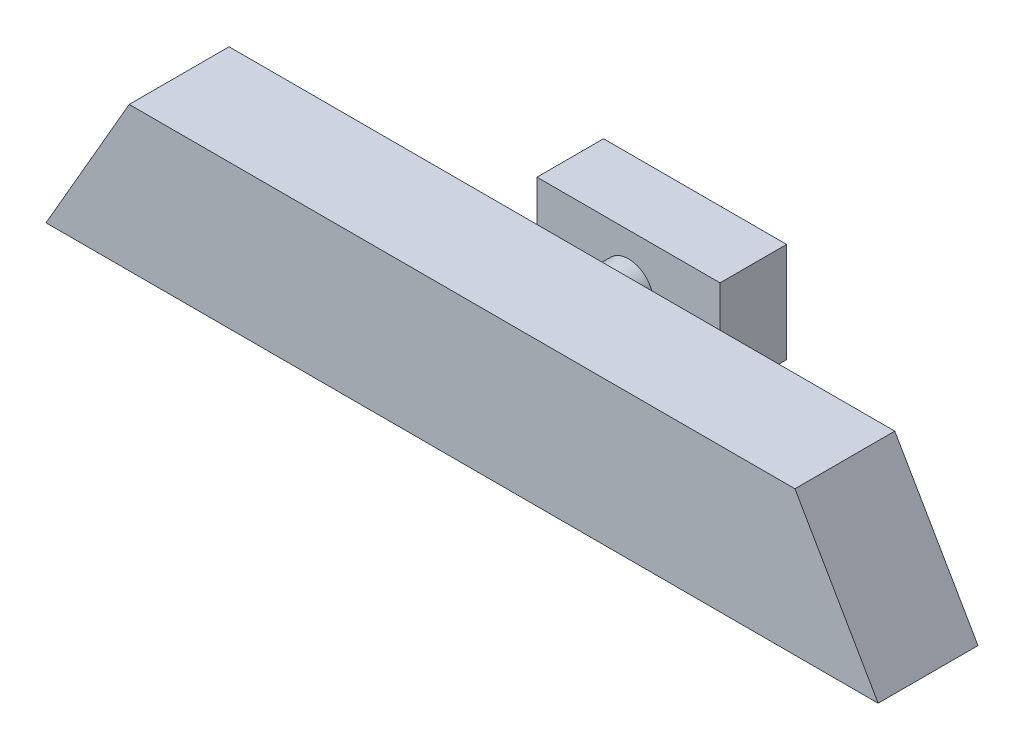
ISO-10303-21;
HEADER;
FILE_DESCRIPTION(('STEP AP214'),'2;1');
FILE_NAME('part.step','',(''),(''),'','','');
FILE_SCHEMA(('AUTOMOTIVE_DESIGN { 1 0 10303 214 1 1 1 1 }'));
ENDSEC;
DATA;
#1=APPLICATION_CONTEXT('core data for automotive mechanical design processes');
#2=APPLICATION_PROTOCOL_DEFINITION('international standard','automotive_design',2000,#1);
#3=PRODUCT_CONTEXT('',#1,'mechanical');
#4=PRODUCT('Part','Part','',(#3));
#5=PRODUCT_RELATED_PRODUCT_CATEGORY('part','',(#4));
#6=PRODUCT_DEFINITION_FORMATION('','',#4);
#7=PRODUCT_DEFINITION_CONTEXT('part definition',#1,'design');
#8=PRODUCT_DEFINITION('design','',#6,#7);
#9=PRODUCT_DEFINITION_SHAPE('','',#8);
#10=(LENGTH_UNIT() NAMED_UNIT(*) SI_UNIT(.MILLI.,.METRE.));
#11=(NAMED_UNIT(*) PLANE_ANGLE_UNIT() SI_UNIT($,.RADIAN.));
#12=(NAMED_UNIT(*) SI_UNIT($,.STERADIAN.) SOLID_ANGLE_UNIT());
#13=UNCERTAINTY_MEASURE_WITH_UNIT(LENGTH_MEASURE(1.E-05),#10,'distance_accuracy_value','');
#14=(GEOMETRIC_REPRESENTATION_CONTEXT(3) GLOBAL_UNCERTAINTY_ASSIGNED_CONTEXT((#13)) GLOBAL_UNIT_ASSIGNED_CONTEXT((#10,
#11,#12)) REPRESENTATION_CONTEXT('',''));
#15=CARTESIAN_POINT('',(0.,0.,0.));
#16=DIRECTION('',(0.,0.,1.));
#17=DIRECTION('',(1.,0.,0.));
#18=AXIS2_PLACEMENT_3D('',#15,#16,#17);
#19=CARTESIAN_POINT('',(-52.4607774957699,0.,0.));
#20=DIRECTION('',(0.,0.,1.));
#21=DIRECTION('',(1.,0.,0.));
#22=AXIS2_PLACEMENT_3D('',#19,#20,#21);
#23=PLANE('',#22);
#24=DIRECTION('',(-0.499999999999999,-0.866025403784439,0.));
#25=VECTOR('',#24,1.);
#26=CARTESIAN_POINT('',(-27.4607774957699,43.301270189222,0.));
#27=LINE('',#26,#25);
#28=CARTESIAN_POINT('',(-27.4607774957699,43.301270189222,0.));
#29=VERTEX_POINT('',#28);
#30=CARTESIAN_POINT('',(-52.4607774957699,0.,0.));
#31=VERTEX_POINT('',#30);
#32=EDGE_CURVE('E136',#29,#31,#27,.T.);
#33=ORIENTED_EDGE('',*,*,#32,.F.);
#34=DIRECTION('',(-1.,0.,0.));
#35=VECTOR('',#34,1.);
#36=CARTESIAN_POINT('',(172.53922250423,43.301270189222,0.));
#37=LINE('',#36,#35);
#38=CARTESIAN_POINT('',(172.53922250423,43.301270189222,0.));
#39=VERTEX_POINT('',#38);
#40=EDGE_CURVE('E73',#39,#29,#37,.T.);
#41=ORIENTED_EDGE('',*,*,#40,.F.);
#42=DIRECTION('',(-0.5,0.866025403784439,0.));
#43=VECTOR('',#42,1.);
#44=CARTESIAN_POINT('',(197.53922250423,0.,0.));
#45=LINE('',#44,#43);
#46=CARTESIAN_POINT('',(197.53922250423,0.,0.));
#47=VERTEX_POINT('',#46);
#48=EDGE_CURVE('E67',#47,#39,#45,.T.);
#49=ORIENTED_EDGE('',*,*,#48,.F.);
#50=DIRECTION('',(1.,0.,0.));
#51=VECTOR('',#50,1.);
#52=CARTESIAN_POINT('',(-52.4607774957699,0.,0.));
#53=LINE('',#52,#51);
#54=EDGE_CURVE('E151',#31,#47,#53,.T.);
#55=ORIENTED_EDGE('',*,*,#54,.F.);
#56=EDGE_LOOP('',(#33,#41,#49,#55));
#57=FACE_BOUND('',#56,.T.);
#58=CARTESIAN_POINT('',(72.5392225042301,20.6266821394395,0.));
#59=DIRECTION('',(0.,0.,1.));
#60=DIRECTION('',(1.,0.,0.));
#61=AXIS2_PLACEMENT_3D('',#58,#59,#60);
#62=CIRCLE('',#61,7.50000000000001);
#63=CARTESIAN_POINT('',(80.0392225042301,20.6266821394395,0.));
#64=VERTEX_POINT('',#63);
#65=EDGE_CURVE('E11',#64,#64,#62,.F.);
#66=ORIENTED_EDGE('',*,*,#65,.F.);
#67=EDGE_LOOP('',(#66));
#68=FACE_BOUND('',#67,.T.);
#69=ADVANCED_FACE('F32',(#57,#68),#23,.F.);
#70=CARTESIAN_POINT('',(-27.4607774957699,43.301270189222,30.));
#71=DIRECTION('',(0.866025403784439,-0.499999999999999,0.));
#72=DIRECTION('',(0.499999999999999,0.866025403784439,0.));
#73=AXIS2_PLACEMENT_3D('',#70,#71,#72);
#74=PLANE('',#73);
#75=ORIENTED_EDGE('',*,*,#32,.T.);
#76=DIRECTION('',(0.,0.,-1.));
#77=VECTOR('',#76,1.);
#78=CARTESIAN_POINT('',(-52.4607774957699,0.,30.));
#79=LINE('',#78,#77);
#80=CARTESIAN_POINT('',(-52.4607774957699,0.,30.));
#81=VERTEX_POINT('',#80);
#82=EDGE_CURVE('E41',#81,#31,#79,.T.);
#83=ORIENTED_EDGE('',*,*,#82,.F.);
#84=DIRECTION('',(-0.499999999999999,-0.866025403784439,0.));
#85=VECTOR('',#84,1.);
#86=CARTESIAN_POINT('',(-27.4607774957699,43.301270189222,30.));
#87=LINE('',#86,#85);
#88=CARTESIAN_POINT('',(-27.4607774957699,43.301270189222,30.));
#89=VERTEX_POINT('',#88);
#90=EDGE_CURVE('E142',#89,#81,#87,.T.);
#91=ORIENTED_EDGE('',*,*,#90,.F.);
#92=DIRECTION('',(0.,0.,-1.));
#93=VECTOR('',#92,1.);
#94=CARTESIAN_POINT('',(-27.4607774957699,43.301270189222,30.));
#95=LINE('',#94,#93);
#96=EDGE_CURVE('E148',#89,#29,#95,.T.);
#97=ORIENTED_EDGE('',*,*,#96,.T.);
#98=EDGE_LOOP('',(#75,#83,#91,#97));
#99=FACE_BOUND('',#98,.T.);
#100=ADVANCED_FACE('F34',(#99),#74,.F.);
#101=CARTESIAN_POINT('',(-52.4607774957699,0.,30.));
#102=DIRECTION('',(0.,1.,0.));
#103=DIRECTION('',(0.,0.,1.));
#104=AXIS2_PLACEMENT_3D('',#101,#102,#103);
#105=PLANE('',#104);
#106=ORIENTED_EDGE('',*,*,#54,.T.);
#107=DIRECTION('',(0.,0.,-1.));
#108=VECTOR('',#107,1.);
#109=CARTESIAN_POINT('',(197.53922250423,0.,30.));
#110=LINE('',#109,#108);
#111=CARTESIAN_POINT('',(197.53922250423,0.,30.));
#112=VERTEX_POINT('',#111);
#113=EDGE_CURVE('E158',#112,#47,#110,.T.);
#114=ORIENTED_EDGE('',*,*,#113,.F.);
#115=DIRECTION('',(1.,0.,0.));
#116=VECTOR('',#115,1.);
#117=CARTESIAN_POINT('',(-52.4607774957699,0.,30.));
#118=LINE('',#117,#116);
#119=EDGE_CURVE('E81',#81,#112,#118,.T.);
#120=ORIENTED_EDGE('',*,*,#119,.F.);
#121=ORIENTED_EDGE('',*,*,#82,.T.);
#122=EDGE_LOOP('',(#106,#114,#120,#121));
#123=FACE_BOUND('',#122,.T.);
#124=ADVANCED_FACE('F160',(#123),#105,.F.);
#125=CARTESIAN_POINT('',(197.53922250423,0.,30.));
#126=DIRECTION('',(-0.866025403784439,-0.5,0.));
#127=DIRECTION('',(0.5,-0.866025403784439,0.));
#128=AXIS2_PLACEMENT_3D('',#125,#126,#127);
#129=PLANE('',#128);
#130=ORIENTED_EDGE('',*,*,#48,.T.);
#131=DIRECTION('',(0.,0.,-1.));
#132=VECTOR('',#131,1.);
#133=CARTESIAN_POINT('',(172.53922250423,43.301270189222,30.));
#134=LINE('',#133,#132);
#135=CARTESIAN_POINT('',(172.53922250423,43.301270189222,30.));
#136=VERTEX_POINT('',#135);
#137=EDGE_CURVE('E156',#136,#39,#134,.T.);
#138=ORIENTED_EDGE('',*,*,#137,.F.);
#139=DIRECTION('',(-0.5,0.866025403784439,0.));
#140=VECTOR('',#139,1.);
#141=CARTESIAN_POINT('',(197.53922250423,0.,30.));
#142=LINE('',#141,#140);
#143=EDGE_CURVE('E145',#112,#136,#142,.T.);
#144=ORIENTED_EDGE('',*,*,#143,.F.);
#145=ORIENTED_EDGE('',*,*,#113,.T.);
#146=EDGE_LOOP('',(#130,#138,#144,#145));
#147=FACE_BOUND('',#146,.T.);
#148=ADVANCED_FACE('F190',(#147),#129,.F.);
#149=CARTESIAN_POINT('',(172.53922250423,43.301270189222,30.));
#150=DIRECTION('',(0.,-1.,0.));
#151=DIRECTION('',(0.,0.,-1.));
#152=AXIS2_PLACEMENT_3D('',#149,#150,#151);
#153=PLANE('',#152);
#154=ORIENTED_EDGE('',*,*,#40,.T.);
#155=ORIENTED_EDGE('',*,*,#96,.F.);
#156=DIRECTION('',(-1.,0.,0.));
#157=VECTOR('',#156,1.);
#158=CARTESIAN_POINT('',(172.53922250423,43.301270189222,30.));
#159=LINE('',#158,#157);
#160=EDGE_CURVE('E49',#136,#89,#159,.T.);
#161=ORIENTED_EDGE('',*,*,#160,.F.);
#162=ORIENTED_EDGE('',*,*,#137,.T.);
#163=EDGE_LOOP('',(#154,#155,#161,#162));
#164=FACE_BOUND('',#163,.T.);
#165=ADVANCED_FACE('F182',(#164),#153,.F.);
#166=CARTESIAN_POINT('',(-52.4607774957699,0.,30.));
#167=DIRECTION('',(0.,0.,1.));
#168=DIRECTION('',(1.,0.,0.));
#169=AXIS2_PLACEMENT_3D('',#166,#167,#168);
#170=PLANE('',#169);
#171=ORIENTED_EDGE('',*,*,#90,.T.);
#172=ORIENTED_EDGE('',*,*,#119,.T.);
#173=ORIENTED_EDGE('',*,*,#143,.T.);
#174=ORIENTED_EDGE('',*,*,#160,.T.);
#175=EDGE_LOOP('',(#171,#172,#173,#174));
#176=FACE_BOUND('',#175,.T.);
#177=ADVANCED_FACE('F173',(#176),#170,.T.);
#178=CARTESIAN_POINT('',(72.5392225042301,20.6266821394395,-20.));
#179=DIRECTION('',(0.,0.,1.));
#180=DIRECTION('',(1.,0.,0.));
#181=AXIS2_PLACEMENT_3D('',#178,#179,#180);
#182=CYLINDRICAL_SURFACE('',#181,7.50000000000001);
#183=CARTESIAN_POINT('',(72.5392225042301,20.6266821394395,-20.));
#184=DIRECTION('',(0.,0.,-1.));
#185=DIRECTION('',(-1.,0.,0.));
#186=AXIS2_PLACEMENT_3D('',#183,#184,#185);
#187=CIRCLE('',#186,7.50000000000001);
#188=CARTESIAN_POINT('',(65.0392225042301,20.6266821394395,-20.));
#189=VERTEX_POINT('',#188);
#190=EDGE_CURVE('E133',#189,#189,#187,.T.);
#191=ORIENTED_EDGE('',*,*,#190,.F.);
#192=EDGE_LOOP('',(#191));
#193=FACE_BOUND('',#192,.T.);
#194=ORIENTED_EDGE('',*,*,#65,.T.);
#195=EDGE_LOOP('',(#194));
#196=FACE_BOUND('',#195,.T.);
#197=ADVANCED_FACE('F170',(#193,#196),#182,.T.);
#198=CARTESIAN_POINT('',(100.03922250423,35.6266821394394,-20.));
#199=DIRECTION('',(0.,0.,-1.));
#200=DIRECTION('',(-1.,0.,0.));
#201=AXIS2_PLACEMENT_3D('',#198,#199,#200);
#202=PLANE('',#201);
#203=DIRECTION('',(0.,-1.,0.));
#204=VECTOR('',#203,1.);
#205=CARTESIAN_POINT('',(100.03922250423,5.62668213943945,-20.));
#206=LINE('',#205,#204);
#207=CARTESIAN_POINT('',(100.03922250423,35.6266821394394,-20.));
#208=VERTEX_POINT('',#207);
#209=CARTESIAN_POINT('',(100.03922250423,5.62668213943945,-20.));
#210=VERTEX_POINT('',#209);
#211=EDGE_CURVE('E132',#208,#210,#206,.T.);
#212=ORIENTED_EDGE('',*,*,#211,.F.);
#213=DIRECTION('',(1.,0.,0.));
#214=VECTOR('',#213,1.);
#215=CARTESIAN_POINT('',(45.0392225042301,35.6266821394395,-20.));
#216=LINE('',#215,#214);
#217=CARTESIAN_POINT('',(45.0392225042301,35.6266821394395,-20.));
#218=VERTEX_POINT('',#217);
#219=EDGE_CURVE('E128',#218,#208,#216,.T.);
#220=ORIENTED_EDGE('',*,*,#219,.F.);
#221=DIRECTION('',(0.,1.,0.));
#222=VECTOR('',#221,1.);
#223=CARTESIAN_POINT('',(45.0392225042301,5.62668213943946,-20.));
#224=LINE('',#223,#222);
#225=CARTESIAN_POINT('',(45.0392225042301,5.62668213943946,-20.));
#226=VERTEX_POINT('',#225);
#227=EDGE_CURVE('E297',#226,#218,#224,.T.);
#228=ORIENTED_EDGE('',*,*,#227,.F.);
#229=DIRECTION('',(-1.,0.,0.));
#230=VECTOR('',#229,1.);
#231=CARTESIAN_POINT('',(45.0392225042301,5.62668213943946,-20.));
#232=LINE('',#231,#230);
#233=EDGE_CURVE('E288',#210,#226,#232,.T.);
#234=ORIENTED_EDGE('',*,*,#233,.F.);
#235=EDGE_LOOP('',(#212,#220,#228,#234));
#236=FACE_BOUND('',#235,.T.);
#237=ORIENTED_EDGE('',*,*,#190,.T.);
#238=EDGE_LOOP('',(#237));
#239=FACE_BOUND('',#238,.T.);
#240=ADVANCED_FACE('F172',(#236,#239),#202,.F.);
#241=CARTESIAN_POINT('',(100.03922250423,5.62668213943945,-40.));
#242=DIRECTION('',(-1.,0.,0.));
#243=DIRECTION('',(0.,0.,1.));
#244=AXIS2_PLACEMENT_3D('',#241,#242,#243);
#245=PLANE('',#244);
#246=ORIENTED_EDGE('',*,*,#211,.T.);
#247=DIRECTION('',(0.,0.,1.));
#248=VECTOR('',#247,1.);
#249=CARTESIAN_POINT('',(100.03922250423,5.62668213943945,-40.));
#250=LINE('',#249,#248);
#251=CARTESIAN_POINT('',(100.03922250423,5.62668213943945,-40.));
#252=VERTEX_POINT('',#251);
#253=EDGE_CURVE('E112',#252,#210,#250,.T.);
#254=ORIENTED_EDGE('',*,*,#253,.F.);
#255=DIRECTION('',(0.,-1.,0.));
#256=VECTOR('',#255,1.);
#257=CARTESIAN_POINT('',(100.03922250423,5.62668213943945,-40.));
#258=LINE('',#257,#256);
#259=CARTESIAN_POINT('',(100.03922250423,35.6266821394394,-40.));
#260=VERTEX_POINT('',#259);
#261=EDGE_CURVE('E119',#260,#252,#258,.T.);
#262=ORIENTED_EDGE('',*,*,#261,.F.);
#263=DIRECTION('',(0.,0.,1.));
#264=VECTOR('',#263,1.);
#265=CARTESIAN_POINT('',(100.03922250423,35.6266821394394,-40.));
#266=LINE('',#265,#264);
#267=EDGE_CURVE('E294',#260,#208,#266,.T.);
#268=ORIENTED_EDGE('',*,*,#267,.T.);
#269=EDGE_LOOP('',(#246,#254,#262,#268));
#270=FACE_BOUND('',#269,.T.);
#271=ADVANCED_FACE('F130',(#270),#245,.F.);
#272=CARTESIAN_POINT('',(45.0392225042301,5.62668213943946,-40.));
#273=DIRECTION('',(0.,1.,0.));
#274=DIRECTION('',(-1.,0.,0.));
#275=AXIS2_PLACEMENT_3D('',#272,#273,#274);
#276=PLANE('',#275);
#277=ORIENTED_EDGE('',*,*,#233,.T.);
#278=DIRECTION('',(0.,0.,1.));
#279=VECTOR('',#278,1.);
#280=CARTESIAN_POINT('',(45.0392225042301,5.62668213943946,-40.));
#281=LINE('',#280,#279);
#282=CARTESIAN_POINT('',(45.0392225042301,5.62668213943946,-40.));
#283=VERTEX_POINT('',#282);
#284=EDGE_CURVE('E115',#283,#226,#281,.T.);
#285=ORIENTED_EDGE('',*,*,#284,.F.);
#286=DIRECTION('',(-1.,0.,0.));
#287=VECTOR('',#286,1.);
#288=CARTESIAN_POINT('',(45.0392225042301,5.62668213943946,-40.));
#289=LINE('',#288,#287);
#290=EDGE_CURVE('E108',#252,#283,#289,.T.);
#291=ORIENTED_EDGE('',*,*,#290,.F.);
#292=ORIENTED_EDGE('',*,*,#253,.T.);
#293=EDGE_LOOP('',(#277,#285,#291,#292));
#294=FACE_BOUND('',#293,.T.);
#295=ADVANCED_FACE('F110',(#294),#276,.F.);
#296=CARTESIAN_POINT('',(45.0392225042301,5.62668213943946,-40.));
#297=DIRECTION('',(1.,0.,0.));
#298=DIRECTION('',(0.,0.,-1.));
#299=AXIS2_PLACEMENT_3D('',#296,#297,#298);
#300=PLANE('',#299);
#301=ORIENTED_EDGE('',*,*,#227,.T.);
#302=DIRECTION('',(0.,0.,1.));
#303=VECTOR('',#302,1.);
#304=CARTESIAN_POINT('',(45.0392225042301,35.6266821394395,-40.));
#305=LINE('',#304,#303);
#306=CARTESIAN_POINT('',(45.0392225042301,35.6266821394395,-40.));
#307=VERTEX_POINT('',#306);
#308=EDGE_CURVE('E138',#307,#218,#305,.T.);
#309=ORIENTED_EDGE('',*,*,#308,.F.);
#310=DIRECTION('',(0.,1.,0.));
#311=VECTOR('',#310,1.);
#312=CARTESIAN_POINT('',(45.0392225042301,5.62668213943946,-40.));
#313=LINE('',#312,#311);
#314=EDGE_CURVE('E118',#283,#307,#313,.T.);
#315=ORIENTED_EDGE('',*,*,#314,.F.);
#316=ORIENTED_EDGE('',*,*,#284,.T.);
#317=EDGE_LOOP('',(#301,#309,#315,#316));
#318=FACE_BOUND('',#317,.T.);
#319=ADVANCED_FACE('F232',(#318),#300,.F.);
#320=CARTESIAN_POINT('',(45.0392225042301,35.6266821394395,-40.));
#321=DIRECTION('',(0.,-1.,0.));
#322=DIRECTION('',(1.,0.,0.));
#323=AXIS2_PLACEMENT_3D('',#320,#321,#322);
#324=PLANE('',#323);
#325=ORIENTED_EDGE('',*,*,#219,.T.);
#326=ORIENTED_EDGE('',*,*,#267,.F.);
#327=DIRECTION('',(1.,0.,0.));
#328=VECTOR('',#327,1.);
#329=CARTESIAN_POINT('',(45.0392225042301,35.6266821394395,-40.));
#330=LINE('',#329,#328);
#331=EDGE_CURVE('E124',#307,#260,#330,.T.);
#332=ORIENTED_EDGE('',*,*,#331,.F.);
#333=ORIENTED_EDGE('',*,*,#308,.T.);
#334=EDGE_LOOP('',(#325,#326,#332,#333));
#335=FACE_BOUND('',#334,.T.);
#336=ADVANCED_FACE('F240',(#335),#324,.F.);
#337=CARTESIAN_POINT('',(100.03922250423,35.6266821394394,-40.));
#338=DIRECTION('',(0.,0.,-1.));
#339=DIRECTION('',(-1.,0.,0.));
#340=AXIS2_PLACEMENT_3D('',#337,#338,#339);
#341=PLANE('',#340);
#342=CARTESIAN_POINT('',(72.5392225042301,20.6266821394395,-40.));
#343=DIRECTION('',(0.,0.,-1.));
#344=DIRECTION('',(-1.,0.,0.));
#345=AXIS2_PLACEMENT_3D('',#342,#343,#344);
#346=CIRCLE('',#345,5.);
#347=CARTESIAN_POINT('',(67.5392225042301,20.6266821394395,-40.));
#348=VERTEX_POINT('',#347);
#349=EDGE_CURVE('E286',#348,#348,#346,.T.);
#350=ORIENTED_EDGE('',*,*,#349,.F.);
#351=EDGE_LOOP('',(#350));
#352=FACE_BOUND('',#351,.T.);
#353=ORIENTED_EDGE('',*,*,#261,.T.);
#354=ORIENTED_EDGE('',*,*,#290,.T.);
#355=ORIENTED_EDGE('',*,*,#314,.T.);
#356=ORIENTED_EDGE('',*,*,#331,.T.);
#357=EDGE_LOOP('',(#353,#354,#355,#356));
#358=FACE_BOUND('',#357,.T.);
#359=ADVANCED_FACE('F122',(#352,#358),#341,.T.);
#360=CARTESIAN_POINT('',(72.5392225042301,20.6266821394395,-30.));
#361=DIRECTION('',(0.,0.,-1.));
#362=DIRECTION('',(-1.,0.,0.));
#363=AXIS2_PLACEMENT_3D('',#360,#361,#362);
#364=CYLINDRICAL_SURFACE('',#363,5.);
#365=CARTESIAN_POINT('',(72.5392225042301,20.6266821394395,-30.));
#366=DIRECTION('',(0.,0.,-1.));
#367=DIRECTION('',(-1.,0.,0.));
#368=AXIS2_PLACEMENT_3D('',#365,#366,#367);
#369=CIRCLE('',#368,5.);
#370=CARTESIAN_POINT('',(67.5392225042301,20.6266821394395,-30.));
#371=VERTEX_POINT('',#370);
#372=EDGE_CURVE('E285',#371,#371,#369,.T.);
#373=ORIENTED_EDGE('',*,*,#372,.F.);
#374=EDGE_LOOP('',(#373));
#375=FACE_BOUND('',#374,.T.);
#376=ORIENTED_EDGE('',*,*,#349,.T.);
#377=EDGE_LOOP('',(#376));
#378=FACE_BOUND('',#377,.T.);
#379=ADVANCED_FACE('F259',(#375,#378),#364,.F.);
#380=CARTESIAN_POINT('',(72.5392225042301,20.6266821394395,-30.));
#381=DIRECTION('',(0.,0.,-1.));
#382=DIRECTION('',(-1.,0.,0.));
#383=AXIS2_PLACEMENT_3D('',#380,#381,#382);
#384=PLANE('',#383);
#385=ORIENTED_EDGE('',*,*,#372,.T.);
#386=EDGE_LOOP('',(#385));
#387=FACE_BOUND('',#386,.T.);
#388=ADVANCED_FACE('F269',(#387),#384,.T.);
#389=CLOSED_SHELL('',(#69,#100,#124,#148,#165,#177,#197,#240,#271,#295,#319,#336,#359,#379,#388));
#390=MANIFOLD_SOLID_BREP('B2',#389);
#391=ADVANCED_BREP_SHAPE_REPRESENTATION('',(#18,#390),#14);
#392=SHAPE_DEFINITION_REPRESENTATION(#9,#391);
ENDSEC;
END-ISO-10303-21;
